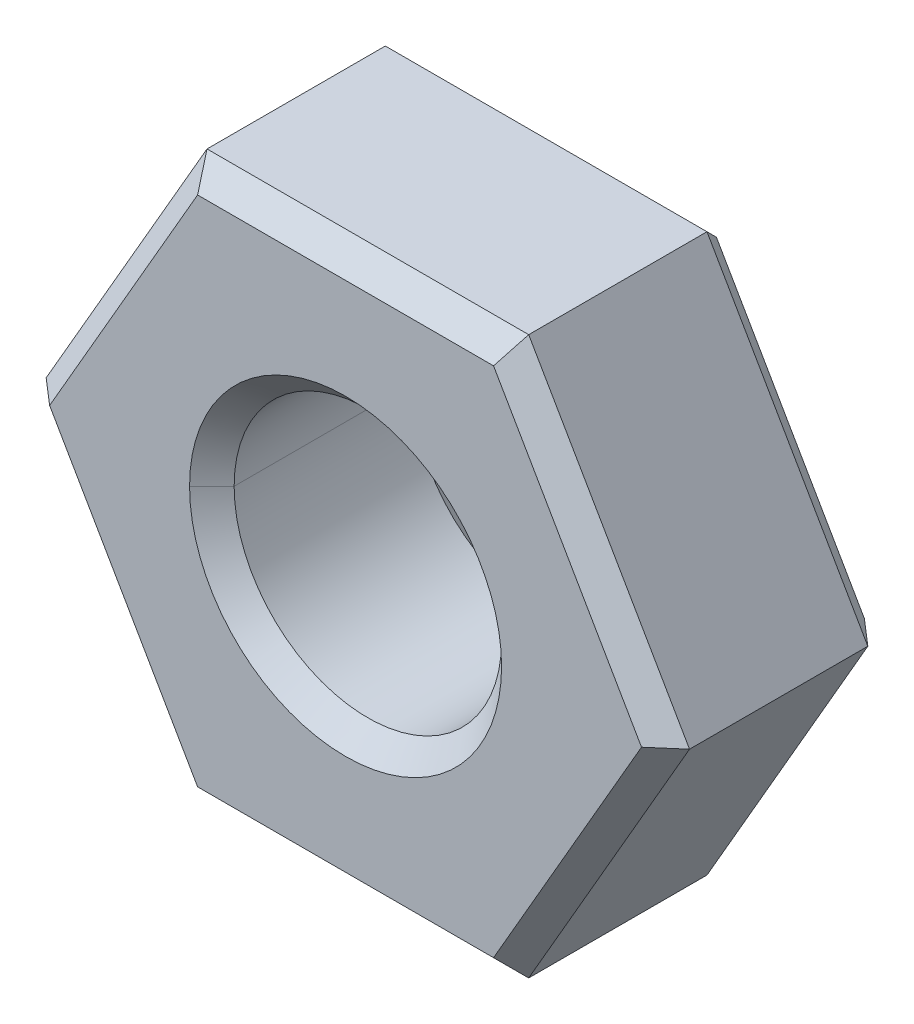
ISO-10303-21;
HEADER;
FILE_DESCRIPTION(('STEP AP214'),'2;1');
FILE_NAME('part.step','',(''),(''),'','','');
FILE_SCHEMA(('AUTOMOTIVE_DESIGN { 1 0 10303 214 1 1 1 1 }'));
ENDSEC;
DATA;
#1=APPLICATION_CONTEXT('core data for automotive mechanical design processes');
#2=APPLICATION_PROTOCOL_DEFINITION('international standard','automotive_design',2000,#1);
#3=PRODUCT_CONTEXT('',#1,'mechanical');
#4=PRODUCT('Part','Part','',(#3));
#5=PRODUCT_RELATED_PRODUCT_CATEGORY('part','',(#4));
#6=PRODUCT_DEFINITION_FORMATION('','',#4);
#7=PRODUCT_DEFINITION_CONTEXT('part definition',#1,'design');
#8=PRODUCT_DEFINITION('design','',#6,#7);
#9=PRODUCT_DEFINITION_SHAPE('','',#8);
#10=(LENGTH_UNIT() NAMED_UNIT(*) SI_UNIT(.MILLI.,.METRE.));
#11=(NAMED_UNIT(*) PLANE_ANGLE_UNIT() SI_UNIT($,.RADIAN.));
#12=(NAMED_UNIT(*) SI_UNIT($,.STERADIAN.) SOLID_ANGLE_UNIT());
#13=UNCERTAINTY_MEASURE_WITH_UNIT(LENGTH_MEASURE(1.E-05),#10,'distance_accuracy_value','');
#14=(GEOMETRIC_REPRESENTATION_CONTEXT(3) GLOBAL_UNCERTAINTY_ASSIGNED_CONTEXT((#13)) GLOBAL_UNIT_ASSIGNED_CONTEXT((#10,
#11,#12)) REPRESENTATION_CONTEXT('',''));
#15=CARTESIAN_POINT('',(0.,0.,0.));
#16=DIRECTION('',(0.,0.,1.));
#17=DIRECTION('',(1.,0.,0.));
#18=AXIS2_PLACEMENT_3D('',#15,#16,#17);
#19=CARTESIAN_POINT('',(2.88675134594813,0.,2.));
#20=DIRECTION('',(0.,0.,1.));
#21=DIRECTION('',(1.,0.,0.));
#22=AXIS2_PLACEMENT_3D('',#19,#20,#21);
#23=PLANE('',#22);
#24=CARTESIAN_POINT('',(0.,0.,2.00000000006639));
#25=DIRECTION('',(0.,0.,1.));
#26=DIRECTION('',(1.,0.,0.));
#27=AXIS2_PLACEMENT_3D('',#24,#25,#26);
#28=CIRCLE('',#27,1.39999999998963);
#29=CARTESIAN_POINT('',(1.39999999998963,0.,2.00000000006639));
#30=VERTEX_POINT('',#29);
#31=CARTESIAN_POINT('',(-1.39999999998963,0.,2.00000000006639));
#32=VERTEX_POINT('',#31);
#33=EDGE_CURVE('E20',#30,#32,#28,.F.);
#34=ORIENTED_EDGE('',*,*,#33,.T.);
#35=CARTESIAN_POINT('',(0.,0.,2.00000000006639));
#36=DIRECTION('',(0.,0.,1.));
#37=DIRECTION('',(1.,0.,0.));
#38=AXIS2_PLACEMENT_3D('',#35,#36,#37);
#39=CIRCLE('',#38,1.39999999998963);
#40=EDGE_CURVE('E56',#32,#30,#39,.F.);
#41=ORIENTED_EDGE('',*,*,#40,.T.);
#42=EDGE_LOOP('',(#34,#41));
#43=FACE_BOUND('',#42,.T.);
#44=DIRECTION('',(-0.499999999999999,-0.866025403784439,0.));
#45=VECTOR('',#44,1.);
#46=CARTESIAN_POINT('',(2.65581123827228,0.,2.));
#47=LINE('',#46,#45);
#48=CARTESIAN_POINT('',(2.65581123827228,0.,2.));
#49=VERTEX_POINT('',#48);
#50=CARTESIAN_POINT('',(1.32790561913614,-2.3,2.));
#51=VERTEX_POINT('',#50);
#52=EDGE_CURVE('E266',#49,#51,#47,.T.);
#53=ORIENTED_EDGE('',*,*,#52,.F.);
#54=DIRECTION('',(0.5,-0.866025403784438,0.));
#55=VECTOR('',#54,1.);
#56=CARTESIAN_POINT('',(1.32790561913614,2.3,2.));
#57=LINE('',#56,#55);
#58=CARTESIAN_POINT('',(1.32790561913614,2.3,2.));
#59=VERTEX_POINT('',#58);
#60=EDGE_CURVE('E259',#59,#49,#57,.T.);
#61=ORIENTED_EDGE('',*,*,#60,.F.);
#62=DIRECTION('',(1.,0.,0.));
#63=VECTOR('',#62,1.);
#64=CARTESIAN_POINT('',(2.88675134594813,2.3,2.));
#65=LINE('',#64,#63);
#66=CARTESIAN_POINT('',(-1.32790561913614,2.3,2.));
#67=VERTEX_POINT('',#66);
#68=EDGE_CURVE('E64',#67,#59,#65,.T.);
#69=ORIENTED_EDGE('',*,*,#68,.F.);
#70=DIRECTION('',(0.5,0.866025403784439,0.));
#71=VECTOR('',#70,1.);
#72=CARTESIAN_POINT('',(-2.65581123827228,0.,2.));
#73=LINE('',#72,#71);
#74=CARTESIAN_POINT('',(-2.65581123827228,0.,2.));
#75=VERTEX_POINT('',#74);
#76=EDGE_CURVE('E281',#75,#67,#73,.T.);
#77=ORIENTED_EDGE('',*,*,#76,.F.);
#78=DIRECTION('',(-0.5,0.866025403784438,0.));
#79=VECTOR('',#78,1.);
#80=CARTESIAN_POINT('',(-1.32790561913614,-2.3,2.));
#81=LINE('',#80,#79);
#82=CARTESIAN_POINT('',(-1.32790561913614,-2.3,2.));
#83=VERTEX_POINT('',#82);
#84=EDGE_CURVE('E277',#83,#75,#81,.T.);
#85=ORIENTED_EDGE('',*,*,#84,.F.);
#86=DIRECTION('',(1.,0.,0.));
#87=VECTOR('',#86,1.);
#88=CARTESIAN_POINT('',(2.88675134594813,-2.3,2.));
#89=LINE('',#88,#87);
#90=EDGE_CURVE('E273',#51,#83,#89,.F.);
#91=ORIENTED_EDGE('',*,*,#90,.F.);
#92=EDGE_LOOP('',(#53,#61,#69,#77,#85,#91));
#93=FACE_BOUND('',#92,.T.);
#94=ADVANCED_FACE('F17',(#43,#93),#23,.T.);
#95=CARTESIAN_POINT('',(2.88675134594813,2.3,2.));
#96=DIRECTION('',(0.,0.707106781186549,0.707106781186546));
#97=DIRECTION('',(0.,-0.707106781186546,0.707106781186549));
#98=AXIS2_PLACEMENT_3D('',#95,#96,#97);
#99=PLANE('',#98);
#100=DIRECTION('',(-0.377964473009225,-0.654653670707976,0.654653670707979));
#101=VECTOR('',#100,1.);
#102=CARTESIAN_POINT('',(1.44337567297406,2.5,1.8));
#103=LINE('',#102,#101);
#104=CARTESIAN_POINT('',(1.44337567297406,2.5,1.8));
#105=VERTEX_POINT('',#104);
#106=EDGE_CURVE('E262',#105,#59,#103,.T.);
#107=ORIENTED_EDGE('',*,*,#106,.F.);
#108=DIRECTION('',(1.,0.,0.));
#109=VECTOR('',#108,1.);
#110=CARTESIAN_POINT('',(1.44337567297406,2.5,1.8));
#111=LINE('',#110,#109);
#112=CARTESIAN_POINT('',(-1.44337567297407,2.5,1.8));
#113=VERTEX_POINT('',#112);
#114=EDGE_CURVE('E241',#105,#113,#111,.F.);
#115=ORIENTED_EDGE('',*,*,#114,.T.);
#116=DIRECTION('',(-0.377964473009223,0.654653670707977,-0.65465367070798));
#117=VECTOR('',#116,1.);
#118=CARTESIAN_POINT('',(-1.32790561913614,2.3,2.));
#119=LINE('',#118,#117);
#120=EDGE_CURVE('E279',#67,#113,#119,.T.);
#121=ORIENTED_EDGE('',*,*,#120,.F.);
#122=ORIENTED_EDGE('',*,*,#68,.T.);
#123=EDGE_LOOP('',(#107,#115,#121,#122));
#124=FACE_BOUND('',#123,.T.);
#125=ADVANCED_FACE('F412',(#124),#99,.T.);
#126=CARTESIAN_POINT('',(-1.27017059221718,2.4,2.));
#127=DIRECTION('',(-0.612372435695798,0.353553390593275,0.707106781186544));
#128=DIRECTION('',(0.755928946018451,0.,0.654653670707981));
#129=AXIS2_PLACEMENT_3D('',#126,#127,#128);
#130=PLANE('',#129);
#131=ORIENTED_EDGE('',*,*,#120,.T.);
#132=DIRECTION('',(0.5,0.866025403784439,0.));
#133=VECTOR('',#132,1.);
#134=CARTESIAN_POINT('',(-1.44337567297407,2.5,1.8));
#135=LINE('',#134,#133);
#136=CARTESIAN_POINT('',(-2.88675134594813,0.,1.8));
#137=VERTEX_POINT('',#136);
#138=EDGE_CURVE('E237',#113,#137,#135,.F.);
#139=ORIENTED_EDGE('',*,*,#138,.T.);
#140=DIRECTION('',(0.755928946018454,0.,0.654653670707977));
#141=VECTOR('',#140,1.);
#142=CARTESIAN_POINT('',(-1.86401658338365,0.,2.68571428571429));
#143=LINE('',#142,#141);
#144=EDGE_CURVE('E275',#75,#137,#143,.F.);
#145=ORIENTED_EDGE('',*,*,#144,.F.);
#146=ORIENTED_EDGE('',*,*,#76,.T.);
#147=EDGE_LOOP('',(#131,#139,#145,#146));
#148=FACE_BOUND('',#147,.T.);
#149=ADVANCED_FACE('F409',(#148),#130,.T.);
#150=CARTESIAN_POINT('',(-1.27017059221718,-2.4,2.));
#151=DIRECTION('',(-0.612372435695795,-0.353553390593274,0.707106781186547));
#152=DIRECTION('',(0.755928946018454,0.,0.654653670707977));
#153=AXIS2_PLACEMENT_3D('',#150,#151,#152);
#154=PLANE('',#153);
#155=ORIENTED_EDGE('',*,*,#144,.T.);
#156=DIRECTION('',(-0.5,0.866025403784439,0.));
#157=VECTOR('',#156,1.);
#158=CARTESIAN_POINT('',(-2.88675134594813,0.,1.8));
#159=LINE('',#158,#157);
#160=CARTESIAN_POINT('',(-1.44337567297407,-2.5,1.8));
#161=VERTEX_POINT('',#160);
#162=EDGE_CURVE('E166',#137,#161,#159,.F.);
#163=ORIENTED_EDGE('',*,*,#162,.T.);
#164=DIRECTION('',(-0.377964473009229,-0.654653670707973,-0.65465367070798));
#165=VECTOR('',#164,1.);
#166=CARTESIAN_POINT('',(-1.32790561913614,-2.3,2.));
#167=LINE('',#166,#165);
#168=EDGE_CURVE('E271',#83,#161,#167,.T.);
#169=ORIENTED_EDGE('',*,*,#168,.F.);
#170=ORIENTED_EDGE('',*,*,#84,.T.);
#171=EDGE_LOOP('',(#155,#163,#169,#170));
#172=FACE_BOUND('',#171,.T.);
#173=ADVANCED_FACE('F405',(#172),#154,.T.);
#174=CARTESIAN_POINT('',(2.88675134594813,-2.3,2.));
#175=DIRECTION('',(0.,-0.707106781186549,0.707106781186546));
#176=DIRECTION('',(0.,-0.707106781186546,-0.707106781186549));
#177=AXIS2_PLACEMENT_3D('',#174,#175,#176);
#178=PLANE('',#177);
#179=ORIENTED_EDGE('',*,*,#168,.T.);
#180=DIRECTION('',(-1.,0.,0.));
#181=VECTOR('',#180,1.);
#182=CARTESIAN_POINT('',(-1.44337567297407,-2.5,1.8));
#183=LINE('',#182,#181);
#184=CARTESIAN_POINT('',(1.44337567297406,-2.5,1.8));
#185=VERTEX_POINT('',#184);
#186=EDGE_CURVE('E163',#161,#185,#183,.F.);
#187=ORIENTED_EDGE('',*,*,#186,.T.);
#188=DIRECTION('',(0.377964473009224,-0.654653670707978,-0.654653670707978));
#189=VECTOR('',#188,1.);
#190=CARTESIAN_POINT('',(1.32790561913614,-2.3,2.));
#191=LINE('',#190,#189);
#192=EDGE_CURVE('E269',#51,#185,#191,.T.);
#193=ORIENTED_EDGE('',*,*,#192,.F.);
#194=ORIENTED_EDGE('',*,*,#90,.T.);
#195=EDGE_LOOP('',(#179,#187,#193,#194));
#196=FACE_BOUND('',#195,.T.);
#197=ADVANCED_FACE('F401',(#196),#178,.T.);
#198=CARTESIAN_POINT('',(2.71354626519124,0.100000000000001,2.));
#199=DIRECTION('',(0.612372435695796,-0.353553390593274,0.707106781186546));
#200=DIRECTION('',(0.755928946018453,0.,-0.654653670707979));
#201=AXIS2_PLACEMENT_3D('',#198,#199,#200);
#202=PLANE('',#201);
#203=DIRECTION('',(0.755928946018453,0.,-0.654653670707979));
#204=VECTOR('',#203,1.);
#205=CARTESIAN_POINT('',(2.68880268222597,0.,1.97142857142857));
#206=LINE('',#205,#204);
#207=CARTESIAN_POINT('',(2.88675134594813,0.,1.8));
#208=VERTEX_POINT('',#207);
#209=EDGE_CURVE('E264',#49,#208,#206,.T.);
#210=ORIENTED_EDGE('',*,*,#209,.F.);
#211=ORIENTED_EDGE('',*,*,#52,.T.);
#212=ORIENTED_EDGE('',*,*,#192,.T.);
#213=DIRECTION('',(-0.5,-0.866025403784439,0.));
#214=VECTOR('',#213,1.);
#215=CARTESIAN_POINT('',(1.44337567297406,-2.5,1.8));
#216=LINE('',#215,#214);
#217=EDGE_CURVE('E228',#185,#208,#216,.F.);
#218=ORIENTED_EDGE('',*,*,#217,.T.);
#219=EDGE_LOOP('',(#210,#211,#212,#218));
#220=FACE_BOUND('',#219,.T.);
#221=ADVANCED_FACE('F397',(#220),#202,.T.);
#222=CARTESIAN_POINT('',(2.71354626519124,-0.0999999999999998,2.));
#223=DIRECTION('',(0.612372435695796,0.353553390593275,0.707106781186545));
#224=DIRECTION('',(0.755928946018453,0.,-0.654653670707979));
#225=AXIS2_PLACEMENT_3D('',#222,#223,#224);
#226=PLANE('',#225);
#227=ORIENTED_EDGE('',*,*,#106,.T.);
#228=ORIENTED_EDGE('',*,*,#60,.T.);
#229=ORIENTED_EDGE('',*,*,#209,.T.);
#230=DIRECTION('',(0.5,-0.866025403784438,0.));
#231=VECTOR('',#230,1.);
#232=CARTESIAN_POINT('',(2.88675134594813,0.,1.8));
#233=LINE('',#232,#231);
#234=EDGE_CURVE('E222',#208,#105,#233,.F.);
#235=ORIENTED_EDGE('',*,*,#234,.T.);
#236=EDGE_LOOP('',(#227,#228,#229,#235));
#237=FACE_BOUND('',#236,.T.);
#238=ADVANCED_FACE('F394',(#237),#226,.T.);
#239=CARTESIAN_POINT('',(0.,0.,2.00000000006639));
#240=DIRECTION('',(0.,0.,1.));
#241=DIRECTION('',(1.,0.,0.));
#242=AXIS2_PLACEMENT_3D('',#239,#240,#241);
#243=CONICAL_SURFACE('',#242,1.39999999998963,0.78539816325534);
#244=DIRECTION('',(0.707106781186547,0.,-0.707106781186548));
#245=VECTOR('',#244,1.);
#246=CARTESIAN_POINT('',(-498999.4,6.1109801798645E-11,499000.));
#247=LINE('',#246,#245);
#248=CARTESIAN_POINT('',(-1.19999999999575,0.,1.80000000000073));
#249=VERTEX_POINT('',#248);
#250=EDGE_CURVE('E244',#249,#32,#247,.F.);
#251=ORIENTED_EDGE('',*,*,#250,.T.);
#252=ORIENTED_EDGE('',*,*,#33,.F.);
#253=DIRECTION('',(-0.707106781186547,0.,-0.707106781186548));
#254=VECTOR('',#253,1.);
#255=CARTESIAN_POINT('',(498999.4,0.,499000.));
#256=LINE('',#255,#254);
#257=CARTESIAN_POINT('',(1.19999999999575,0.,1.80000000000073));
#258=VERTEX_POINT('',#257);
#259=EDGE_CURVE('E252',#30,#258,#256,.T.);
#260=ORIENTED_EDGE('',*,*,#259,.T.);
#261=CARTESIAN_POINT('',(0.,0.,1.8));
#262=DIRECTION('',(0.,0.,-1.));
#263=DIRECTION('',(-1.,0.,0.));
#264=AXIS2_PLACEMENT_3D('',#261,#262,#263);
#265=CIRCLE('',#264,1.2);
#266=EDGE_CURVE('E93',#258,#249,#265,.T.);
#267=ORIENTED_EDGE('',*,*,#266,.T.);
#268=EDGE_LOOP('',(#251,#252,#260,#267));
#269=FACE_BOUND('',#268,.T.);
#270=ADVANCED_FACE('F288',(#269),#243,.F.);
#271=CARTESIAN_POINT('',(0.,0.,2.00000000006639));
#272=DIRECTION('',(0.,0.,1.));
#273=DIRECTION('',(1.,0.,0.));
#274=AXIS2_PLACEMENT_3D('',#271,#272,#273);
#275=CONICAL_SURFACE('',#274,1.39999999998963,0.78539816325534);
#276=CARTESIAN_POINT('',(0.,0.,1.8));
#277=DIRECTION('',(0.,0.,-1.));
#278=DIRECTION('',(-1.,0.,0.));
#279=AXIS2_PLACEMENT_3D('',#276,#277,#278);
#280=CIRCLE('',#279,1.2);
#281=EDGE_CURVE('E214',#249,#258,#280,.T.);
#282=ORIENTED_EDGE('',*,*,#281,.T.);
#283=ORIENTED_EDGE('',*,*,#259,.F.);
#284=ORIENTED_EDGE('',*,*,#40,.F.);
#285=ORIENTED_EDGE('',*,*,#250,.F.);
#286=EDGE_LOOP('',(#282,#283,#284,#285));
#287=FACE_BOUND('',#286,.T.);
#288=ADVANCED_FACE('F289',(#287),#275,.F.);
#289=CARTESIAN_POINT('',(1.44337567297406,2.5,2.));
#290=DIRECTION('',(0.,-1.,0.));
#291=DIRECTION('',(0.,0.,-1.));
#292=AXIS2_PLACEMENT_3D('',#289,#290,#291);
#293=PLANE('',#292);
#294=DIRECTION('',(0.,0.,1.));
#295=VECTOR('',#294,1.);
#296=CARTESIAN_POINT('',(-1.44337567297407,2.5,2.));
#297=LINE('',#296,#295);
#298=CARTESIAN_POINT('',(-1.44337567297407,2.5,0.199999999999999));
#299=VERTEX_POINT('',#298);
#300=EDGE_CURVE('E101',#299,#113,#297,.T.);
#301=ORIENTED_EDGE('',*,*,#300,.T.);
#302=ORIENTED_EDGE('',*,*,#114,.F.);
#303=DIRECTION('',(0.,0.,1.));
#304=VECTOR('',#303,1.);
#305=CARTESIAN_POINT('',(1.44337567297406,2.5,2.));
#306=LINE('',#305,#304);
#307=CARTESIAN_POINT('',(1.44337567297406,2.5,0.199999999999999));
#308=VERTEX_POINT('',#307);
#309=EDGE_CURVE('E220',#105,#308,#306,.F.);
#310=ORIENTED_EDGE('',*,*,#309,.T.);
#311=DIRECTION('',(1.,0.,0.));
#312=VECTOR('',#311,1.);
#313=CARTESIAN_POINT('',(1.44337567297406,2.5,0.199999999999999));
#314=LINE('',#313,#312);
#315=EDGE_CURVE('E142',#308,#299,#314,.F.);
#316=ORIENTED_EDGE('',*,*,#315,.T.);
#317=EDGE_LOOP('',(#301,#302,#310,#316));
#318=FACE_BOUND('',#317,.T.);
#319=ADVANCED_FACE('F386',(#318),#293,.F.);
#320=CARTESIAN_POINT('',(-1.44337567297407,2.5,2.));
#321=DIRECTION('',(0.866025403784439,-0.5,0.));
#322=DIRECTION('',(0.5,0.866025403784439,0.));
#323=AXIS2_PLACEMENT_3D('',#320,#321,#322);
#324=PLANE('',#323);
#325=DIRECTION('',(0.,0.,1.));
#326=VECTOR('',#325,1.);
#327=CARTESIAN_POINT('',(-2.88675134594813,0.,2.));
#328=LINE('',#327,#326);
#329=CARTESIAN_POINT('',(-2.88675134594813,0.,0.199999999999998));
#330=VERTEX_POINT('',#329);
#331=EDGE_CURVE('E172',#330,#137,#328,.T.);
#332=ORIENTED_EDGE('',*,*,#331,.T.);
#333=ORIENTED_EDGE('',*,*,#138,.F.);
#334=ORIENTED_EDGE('',*,*,#300,.F.);
#335=DIRECTION('',(-0.5,-0.866025403784439,0.));
#336=VECTOR('',#335,1.);
#337=CARTESIAN_POINT('',(-1.44337567297407,2.5,0.199999999999999));
#338=LINE('',#337,#336);
#339=EDGE_CURVE('E198',#299,#330,#338,.T.);
#340=ORIENTED_EDGE('',*,*,#339,.T.);
#341=EDGE_LOOP('',(#332,#333,#334,#340));
#342=FACE_BOUND('',#341,.T.);
#343=ADVANCED_FACE('F383',(#342),#324,.F.);
#344=CARTESIAN_POINT('',(-2.88675134594813,0.,2.));
#345=DIRECTION('',(0.866025403784439,0.5,0.));
#346=DIRECTION('',(-0.5,0.866025403784439,0.));
#347=AXIS2_PLACEMENT_3D('',#344,#345,#346);
#348=PLANE('',#347);
#349=DIRECTION('',(0.,0.,1.));
#350=VECTOR('',#349,1.);
#351=CARTESIAN_POINT('',(-1.44337567297407,-2.5,2.));
#352=LINE('',#351,#350);
#353=CARTESIAN_POINT('',(-1.44337567297407,-2.5,0.199999999999999));
#354=VERTEX_POINT('',#353);
#355=EDGE_CURVE('E155',#354,#161,#352,.T.);
#356=ORIENTED_EDGE('',*,*,#355,.T.);
#357=ORIENTED_EDGE('',*,*,#162,.F.);
#358=ORIENTED_EDGE('',*,*,#331,.F.);
#359=DIRECTION('',(0.5,-0.866025403784439,0.));
#360=VECTOR('',#359,1.);
#361=CARTESIAN_POINT('',(-2.88675134594813,0.,0.199999999999999));
#362=LINE('',#361,#360);
#363=EDGE_CURVE('E169',#330,#354,#362,.T.);
#364=ORIENTED_EDGE('',*,*,#363,.T.);
#365=EDGE_LOOP('',(#356,#357,#358,#364));
#366=FACE_BOUND('',#365,.T.);
#367=ADVANCED_FACE('F170',(#366),#348,.F.);
#368=CARTESIAN_POINT('',(-1.44337567297407,-2.5,2.));
#369=DIRECTION('',(0.,1.,0.));
#370=DIRECTION('',(-1.,0.,0.));
#371=AXIS2_PLACEMENT_3D('',#368,#369,#370);
#372=PLANE('',#371);
#373=DIRECTION('',(0.,0.,1.));
#374=VECTOR('',#373,1.);
#375=CARTESIAN_POINT('',(1.44337567297406,-2.5,2.));
#376=LINE('',#375,#374);
#377=CARTESIAN_POINT('',(1.44337567297406,-2.5,0.199999999999999));
#378=VERTEX_POINT('',#377);
#379=EDGE_CURVE('E231',#378,#185,#376,.T.);
#380=ORIENTED_EDGE('',*,*,#379,.T.);
#381=ORIENTED_EDGE('',*,*,#186,.F.);
#382=ORIENTED_EDGE('',*,*,#355,.F.);
#383=DIRECTION('',(1.,0.,0.));
#384=VECTOR('',#383,1.);
#385=CARTESIAN_POINT('',(-1.44337567297407,-2.5,0.199999999999999));
#386=LINE('',#385,#384);
#387=EDGE_CURVE('E160',#354,#378,#386,.T.);
#388=ORIENTED_EDGE('',*,*,#387,.T.);
#389=EDGE_LOOP('',(#380,#381,#382,#388));
#390=FACE_BOUND('',#389,.T.);
#391=ADVANCED_FACE('F158',(#390),#372,.F.);
#392=CARTESIAN_POINT('',(1.44337567297406,-2.5,2.));
#393=DIRECTION('',(-0.866025403784439,0.5,0.));
#394=DIRECTION('',(-0.5,-0.866025403784439,0.));
#395=AXIS2_PLACEMENT_3D('',#392,#393,#394);
#396=PLANE('',#395);
#397=DIRECTION('',(0.,0.,1.));
#398=VECTOR('',#397,1.);
#399=CARTESIAN_POINT('',(2.88675134594813,0.,2.));
#400=LINE('',#399,#398);
#401=CARTESIAN_POINT('',(2.88675134594813,0.,0.199999999999999));
#402=VERTEX_POINT('',#401);
#403=EDGE_CURVE('E225',#402,#208,#400,.T.);
#404=ORIENTED_EDGE('',*,*,#403,.T.);
#405=ORIENTED_EDGE('',*,*,#217,.F.);
#406=ORIENTED_EDGE('',*,*,#379,.F.);
#407=DIRECTION('',(0.499999999999999,0.866025403784439,0.));
#408=VECTOR('',#407,1.);
#409=CARTESIAN_POINT('',(1.44337567297406,-2.5,0.199999999999999));
#410=LINE('',#409,#408);
#411=EDGE_CURVE('E310',#378,#402,#410,.T.);
#412=ORIENTED_EDGE('',*,*,#411,.T.);
#413=EDGE_LOOP('',(#404,#405,#406,#412));
#414=FACE_BOUND('',#413,.T.);
#415=ADVANCED_FACE('F314',(#414),#396,.F.);
#416=CARTESIAN_POINT('',(2.88675134594813,0.,2.));
#417=DIRECTION('',(-0.866025403784438,-0.5,0.));
#418=DIRECTION('',(0.5,-0.866025403784438,0.));
#419=AXIS2_PLACEMENT_3D('',#416,#417,#418);
#420=PLANE('',#419);
#421=ORIENTED_EDGE('',*,*,#309,.F.);
#422=ORIENTED_EDGE('',*,*,#234,.F.);
#423=ORIENTED_EDGE('',*,*,#403,.F.);
#424=DIRECTION('',(-0.5,0.866025403784439,0.));
#425=VECTOR('',#424,1.);
#426=CARTESIAN_POINT('',(2.88675134594813,0.,0.199999999999999));
#427=LINE('',#426,#425);
#428=EDGE_CURVE('E304',#402,#308,#427,.T.);
#429=ORIENTED_EDGE('',*,*,#428,.T.);
#430=EDGE_LOOP('',(#421,#422,#423,#429));
#431=FACE_BOUND('',#430,.T.);
#432=ADVANCED_FACE('F374',(#431),#420,.F.);
#433=CARTESIAN_POINT('',(0.,0.,2.));
#434=DIRECTION('',(0.,0.,-1.));
#435=DIRECTION('',(-1.,0.,0.));
#436=AXIS2_PLACEMENT_3D('',#433,#434,#435);
#437=CYLINDRICAL_SURFACE('',#436,1.2);
#438=DIRECTION('',(0.,0.,-1.));
#439=VECTOR('',#438,1.);
#440=CARTESIAN_POINT('',(1.2,0.,2.));
#441=LINE('',#440,#439);
#442=CARTESIAN_POINT('',(1.19999999998724,0.,0.200000000006639));
#443=VERTEX_POINT('',#442);
#444=EDGE_CURVE('E203',#258,#443,#441,.T.);
#445=ORIENTED_EDGE('',*,*,#444,.T.);
#446=CARTESIAN_POINT('',(0.,0.,0.200000000006639));
#447=DIRECTION('',(0.,0.,-1.));
#448=DIRECTION('',(-1.,0.,0.));
#449=AXIS2_PLACEMENT_3D('',#446,#447,#448);
#450=CIRCLE('',#449,1.19999999998299);
#451=CARTESIAN_POINT('',(-1.19999999998724,0.,0.200000000006639));
#452=VERTEX_POINT('',#451);
#453=EDGE_CURVE('E126',#443,#452,#450,.T.);
#454=ORIENTED_EDGE('',*,*,#453,.T.);
#455=DIRECTION('',(0.,0.,-1.));
#456=VECTOR('',#455,1.);
#457=CARTESIAN_POINT('',(-1.2,0.,2.));
#458=LINE('',#457,#456);
#459=EDGE_CURVE('E135',#452,#249,#458,.F.);
#460=ORIENTED_EDGE('',*,*,#459,.T.);
#461=ORIENTED_EDGE('',*,*,#266,.F.);
#462=EDGE_LOOP('',(#445,#454,#460,#461));
#463=FACE_BOUND('',#462,.T.);
#464=ADVANCED_FACE('F292',(#463),#437,.F.);
#465=CARTESIAN_POINT('',(0.,0.,2.));
#466=DIRECTION('',(0.,0.,-1.));
#467=DIRECTION('',(-1.,0.,0.));
#468=AXIS2_PLACEMENT_3D('',#465,#466,#467);
#469=CYLINDRICAL_SURFACE('',#468,1.2);
#470=ORIENTED_EDGE('',*,*,#281,.F.);
#471=ORIENTED_EDGE('',*,*,#459,.F.);
#472=CARTESIAN_POINT('',(0.,0.,0.200000000006639));
#473=DIRECTION('',(0.,0.,-1.));
#474=DIRECTION('',(-1.,0.,0.));
#475=AXIS2_PLACEMENT_3D('',#472,#473,#474);
#476=CIRCLE('',#475,1.19999999998299);
#477=EDGE_CURVE('E208',#452,#443,#476,.T.);
#478=ORIENTED_EDGE('',*,*,#477,.T.);
#479=ORIENTED_EDGE('',*,*,#444,.F.);
#480=EDGE_LOOP('',(#470,#471,#478,#479));
#481=FACE_BOUND('',#480,.T.);
#482=ADVANCED_FACE('F291',(#481),#469,.F.);
#483=CARTESIAN_POINT('',(1.44337567297406,2.5,0.199999999999999));
#484=DIRECTION('',(0.,-0.707106781186546,0.707106781186549));
#485=DIRECTION('',(0.,-0.707106781186549,-0.707106781186546));
#486=AXIS2_PLACEMENT_3D('',#483,#484,#485);
#487=PLANE('',#486);
#488=DIRECTION('',(-0.377964473009225,-0.65465367070798,-0.654653670707975));
#489=VECTOR('',#488,1.);
#490=CARTESIAN_POINT('',(1.44337567297406,2.5,0.199999999999998));
#491=LINE('',#490,#489);
#492=CARTESIAN_POINT('',(1.32790561913614,2.3,0.));
#493=VERTEX_POINT('',#492);
#494=EDGE_CURVE('E205',#308,#493,#491,.T.);
#495=ORIENTED_EDGE('',*,*,#494,.T.);
#496=DIRECTION('',(1.,0.,0.));
#497=VECTOR('',#496,1.);
#498=CARTESIAN_POINT('',(2.88675134594813,2.3,0.));
#499=LINE('',#498,#497);
#500=CARTESIAN_POINT('',(-1.32790561913614,2.3,0.));
#501=VERTEX_POINT('',#500);
#502=EDGE_CURVE('E341',#493,#501,#499,.F.);
#503=ORIENTED_EDGE('',*,*,#502,.T.);
#504=DIRECTION('',(-0.377964473009226,0.654653670707978,0.654653670707976));
#505=VECTOR('',#504,1.);
#506=CARTESIAN_POINT('',(-1.32790561913614,2.3,0.));
#507=LINE('',#506,#505);
#508=EDGE_CURVE('E200',#501,#299,#507,.T.);
#509=ORIENTED_EDGE('',*,*,#508,.T.);
#510=ORIENTED_EDGE('',*,*,#315,.F.);
#511=EDGE_LOOP('',(#495,#503,#509,#510));
#512=FACE_BOUND('',#511,.T.);
#513=ADVANCED_FACE('F366',(#512),#487,.F.);
#514=CARTESIAN_POINT('',(-1.44337567297407,2.5,0.199999999999999));
#515=DIRECTION('',(0.612372435695794,-0.353553390593273,0.707106781186548));
#516=DIRECTION('',(0.755928946018455,0.,-0.654653670707977));
#517=AXIS2_PLACEMENT_3D('',#514,#515,#516);
#518=PLANE('',#517);
#519=ORIENTED_EDGE('',*,*,#508,.F.);
#520=DIRECTION('',(-0.5,-0.866025403784439,0.));
#521=VECTOR('',#520,1.);
#522=CARTESIAN_POINT('',(-1.32790561913614,2.3,0.));
#523=LINE('',#522,#521);
#524=CARTESIAN_POINT('',(-2.65581123827228,0.,0.));
#525=VERTEX_POINT('',#524);
#526=EDGE_CURVE('E338',#501,#525,#523,.T.);
#527=ORIENTED_EDGE('',*,*,#526,.T.);
#528=DIRECTION('',(0.755928946018456,0.,-0.654653670707976));
#529=VECTOR('',#528,1.);
#530=CARTESIAN_POINT('',(-2.88675134594813,0.,0.199999999999999));
#531=LINE('',#530,#529);
#532=EDGE_CURVE('E178',#525,#330,#531,.F.);
#533=ORIENTED_EDGE('',*,*,#532,.T.);
#534=ORIENTED_EDGE('',*,*,#339,.F.);
#535=EDGE_LOOP('',(#519,#527,#533,#534));
#536=FACE_BOUND('',#535,.T.);
#537=ADVANCED_FACE('F363',(#536),#518,.F.);
#538=CARTESIAN_POINT('',(-2.88675134594813,0.,0.199999999999999));
#539=DIRECTION('',(0.612372435695794,0.353553390593273,0.707106781186549));
#540=DIRECTION('',(0.755928946018456,0.,-0.654653670707976));
#541=AXIS2_PLACEMENT_3D('',#538,#539,#540);
#542=PLANE('',#541);
#543=DIRECTION('',(-0.377964473009229,-0.654653670707978,0.654653670707975));
#544=VECTOR('',#543,1.);
#545=CARTESIAN_POINT('',(-1.32790561913614,-2.3,0.));
#546=LINE('',#545,#544);
#547=CARTESIAN_POINT('',(-1.32790561913614,-2.3,0.));
#548=VERTEX_POINT('',#547);
#549=EDGE_CURVE('E177',#548,#354,#546,.T.);
#550=ORIENTED_EDGE('',*,*,#549,.T.);
#551=ORIENTED_EDGE('',*,*,#363,.F.);
#552=ORIENTED_EDGE('',*,*,#532,.F.);
#553=DIRECTION('',(0.5,-0.866025403784438,0.));
#554=VECTOR('',#553,1.);
#555=CARTESIAN_POINT('',(-2.65581123827228,0.,0.));
#556=LINE('',#555,#554);
#557=EDGE_CURVE('E193',#525,#548,#556,.T.);
#558=ORIENTED_EDGE('',*,*,#557,.T.);
#559=EDGE_LOOP('',(#550,#551,#552,#558));
#560=FACE_BOUND('',#559,.T.);
#561=ADVANCED_FACE('F191',(#560),#542,.F.);
#562=CARTESIAN_POINT('',(-1.44337567297407,-2.5,0.199999999999999));
#563=DIRECTION('',(0.,0.707106781186546,0.707106781186549));
#564=DIRECTION('',(0.,-0.707106781186549,0.707106781186546));
#565=AXIS2_PLACEMENT_3D('',#562,#563,#564);
#566=PLANE('',#565);
#567=DIRECTION('',(0.377964473009226,-0.654653670707979,0.654653670707976));
#568=VECTOR('',#567,1.);
#569=CARTESIAN_POINT('',(1.32790561913614,-2.3,0.));
#570=LINE('',#569,#568);
#571=CARTESIAN_POINT('',(1.32790561913614,-2.3,0.));
#572=VERTEX_POINT('',#571);
#573=EDGE_CURVE('E188',#572,#378,#570,.T.);
#574=ORIENTED_EDGE('',*,*,#573,.T.);
#575=ORIENTED_EDGE('',*,*,#387,.F.);
#576=ORIENTED_EDGE('',*,*,#549,.F.);
#577=DIRECTION('',(1.,0.,0.));
#578=VECTOR('',#577,1.);
#579=CARTESIAN_POINT('',(2.88675134594813,-2.3,0.));
#580=LINE('',#579,#578);
#581=EDGE_CURVE('E332',#548,#572,#580,.T.);
#582=ORIENTED_EDGE('',*,*,#581,.T.);
#583=EDGE_LOOP('',(#574,#575,#576,#582));
#584=FACE_BOUND('',#583,.T.);
#585=ADVANCED_FACE('F183',(#584),#566,.F.);
#586=CARTESIAN_POINT('',(1.44337567297406,-2.5,0.199999999999999));
#587=DIRECTION('',(-0.612372435695794,0.353553390593273,0.707106781186548));
#588=DIRECTION('',(0.755928946018455,0.,0.654653670707977));
#589=AXIS2_PLACEMENT_3D('',#586,#587,#588);
#590=PLANE('',#589);
#591=DIRECTION('',(0.755928946018456,0.,0.654653670707976));
#592=VECTOR('',#591,1.);
#593=CARTESIAN_POINT('',(2.88675134594813,0.,0.199999999999999));
#594=LINE('',#593,#592);
#595=CARTESIAN_POINT('',(2.65581123827228,0.,0.));
#596=VERTEX_POINT('',#595);
#597=EDGE_CURVE('E307',#596,#402,#594,.T.);
#598=ORIENTED_EDGE('',*,*,#597,.T.);
#599=ORIENTED_EDGE('',*,*,#411,.F.);
#600=ORIENTED_EDGE('',*,*,#573,.F.);
#601=DIRECTION('',(0.499999999999999,0.866025403784439,0.));
#602=VECTOR('',#601,1.);
#603=CARTESIAN_POINT('',(1.32790561913614,-2.3,0.));
#604=LINE('',#603,#602);
#605=EDGE_CURVE('E328',#572,#596,#604,.T.);
#606=ORIENTED_EDGE('',*,*,#605,.T.);
#607=EDGE_LOOP('',(#598,#599,#600,#606));
#608=FACE_BOUND('',#607,.T.);
#609=ADVANCED_FACE('F326',(#608),#590,.F.);
#610=CARTESIAN_POINT('',(2.88675134594813,0.,0.199999999999999));
#611=DIRECTION('',(-0.612372435695793,-0.353553390593273,0.707106781186549));
#612=DIRECTION('',(0.755928946018456,0.,0.654653670707976));
#613=AXIS2_PLACEMENT_3D('',#610,#611,#612);
#614=PLANE('',#613);
#615=ORIENTED_EDGE('',*,*,#494,.F.);
#616=ORIENTED_EDGE('',*,*,#428,.F.);
#617=ORIENTED_EDGE('',*,*,#597,.F.);
#618=DIRECTION('',(-0.5,0.866025403784439,0.));
#619=VECTOR('',#618,1.);
#620=CARTESIAN_POINT('',(2.65581123827228,0.,0.));
#621=LINE('',#620,#619);
#622=EDGE_CURVE('E285',#596,#493,#621,.T.);
#623=ORIENTED_EDGE('',*,*,#622,.T.);
#624=EDGE_LOOP('',(#615,#616,#617,#623));
#625=FACE_BOUND('',#624,.T.);
#626=ADVANCED_FACE('F320',(#625),#614,.F.);
#627=CARTESIAN_POINT('',(0.,0.,0.));
#628=DIRECTION('',(0.,0.,-1.));
#629=DIRECTION('',(-1.,0.,0.));
#630=AXIS2_PLACEMENT_3D('',#627,#628,#629);
#631=CONICAL_SURFACE('',#630,1.40000000004648,0.785398163539557);
#632=DIRECTION('',(-0.707106781186547,0.,0.707106781186548));
#633=VECTOR('',#632,1.);
#634=CARTESIAN_POINT('',(499000.,6.11098752774529E-11,-498998.6));
#635=LINE('',#634,#633);
#636=CARTESIAN_POINT('',(1.40000000004648,0.,0.));
#637=VERTEX_POINT('',#636);
#638=EDGE_CURVE('E210',#443,#637,#635,.F.);
#639=ORIENTED_EDGE('',*,*,#638,.T.);
#640=CARTESIAN_POINT('',(0.,0.,0.));
#641=DIRECTION('',(0.,0.,-1.));
#642=DIRECTION('',(-1.,0.,0.));
#643=AXIS2_PLACEMENT_3D('',#640,#641,#642);
#644=CIRCLE('',#643,1.40000000004648);
#645=CARTESIAN_POINT('',(-1.40000000004648,0.,0.));
#646=VERTEX_POINT('',#645);
#647=EDGE_CURVE('E26',#637,#646,#644,.T.);
#648=ORIENTED_EDGE('',*,*,#647,.T.);
#649=DIRECTION('',(0.707106781186547,0.,0.707106781186548));
#650=VECTOR('',#649,1.);
#651=CARTESIAN_POINT('',(-499000.,0.,-498998.6));
#652=LINE('',#651,#650);
#653=EDGE_CURVE('E34',#646,#452,#652,.T.);
#654=ORIENTED_EDGE('',*,*,#653,.T.);
#655=ORIENTED_EDGE('',*,*,#453,.F.);
#656=EDGE_LOOP('',(#639,#648,#654,#655));
#657=FACE_BOUND('',#656,.T.);
#658=ADVANCED_FACE('F295',(#657),#631,.F.);
#659=CARTESIAN_POINT('',(0.,0.,0.));
#660=DIRECTION('',(0.,0.,-1.));
#661=DIRECTION('',(-1.,0.,0.));
#662=AXIS2_PLACEMENT_3D('',#659,#660,#661);
#663=CONICAL_SURFACE('',#662,1.40000000004648,0.785398163539557);
#664=ORIENTED_EDGE('',*,*,#477,.F.);
#665=ORIENTED_EDGE('',*,*,#653,.F.);
#666=CARTESIAN_POINT('',(0.,0.,0.));
#667=DIRECTION('',(0.,0.,-1.));
#668=DIRECTION('',(-1.,0.,0.));
#669=AXIS2_PLACEMENT_3D('',#666,#667,#668);
#670=CIRCLE('',#669,1.40000000004648);
#671=EDGE_CURVE('E11',#646,#637,#670,.T.);
#672=ORIENTED_EDGE('',*,*,#671,.T.);
#673=ORIENTED_EDGE('',*,*,#638,.F.);
#674=EDGE_LOOP('',(#664,#665,#672,#673));
#675=FACE_BOUND('',#674,.T.);
#676=ADVANCED_FACE('F294',(#675),#663,.F.);
#677=CARTESIAN_POINT('',(2.88675134594813,0.,0.));
#678=DIRECTION('',(0.,0.,1.));
#679=DIRECTION('',(1.,0.,0.));
#680=AXIS2_PLACEMENT_3D('',#677,#678,#679);
#681=PLANE('',#680);
#682=ORIENTED_EDGE('',*,*,#647,.F.);
#683=ORIENTED_EDGE('',*,*,#671,.F.);
#684=EDGE_LOOP('',(#682,#683));
#685=FACE_BOUND('',#684,.T.);
#686=ORIENTED_EDGE('',*,*,#605,.F.);
#687=ORIENTED_EDGE('',*,*,#581,.F.);
#688=ORIENTED_EDGE('',*,*,#557,.F.);
#689=ORIENTED_EDGE('',*,*,#526,.F.);
#690=ORIENTED_EDGE('',*,*,#502,.F.);
#691=ORIENTED_EDGE('',*,*,#622,.F.);
#692=EDGE_LOOP('',(#686,#687,#688,#689,#690,#691));
#693=FACE_BOUND('',#692,.T.);
#694=ADVANCED_FACE('F344',(#685,#693),#681,.F.);
#695=CLOSED_SHELL('',(#94,#125,#149,#173,#197,#221,#238,#270,#288,#319,#343,#367,#391,#415,#432,
#464,#482,#513,#537,#561,#585,#609,#626,#658,#676,#694));
#696=MANIFOLD_SOLID_BREP('B1',#695);
#697=ADVANCED_BREP_SHAPE_REPRESENTATION('',(#18,#696),#14);
#698=SHAPE_DEFINITION_REPRESENTATION(#9,#697);
ENDSEC;
END-ISO-10303-21;
